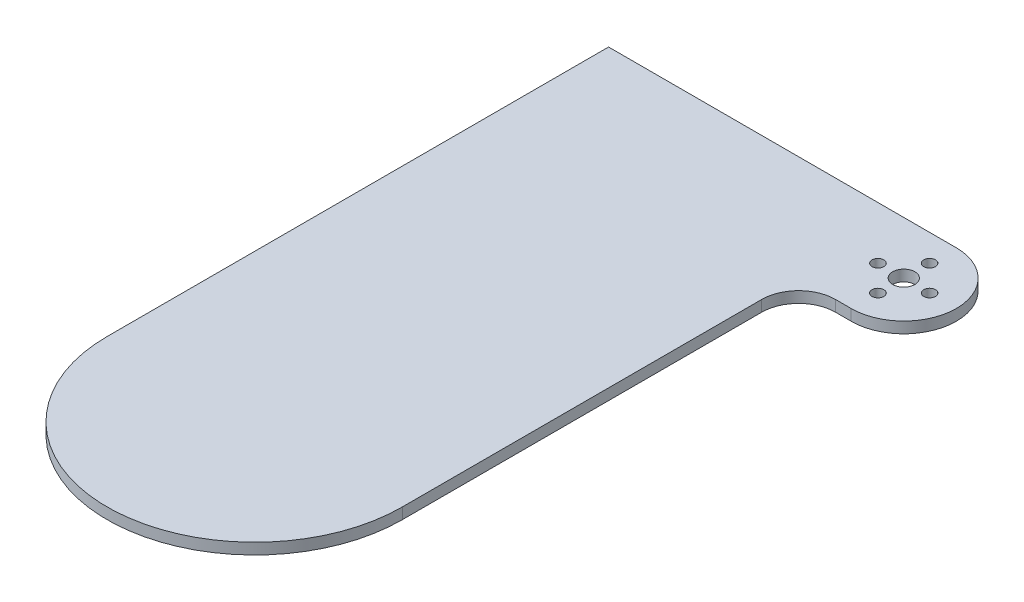
ISO-10303-21;
HEADER;
FILE_DESCRIPTION(('STEP AP214'),'2;1');
FILE_NAME('part.step','',(''),(''),'','','');
FILE_SCHEMA(('AUTOMOTIVE_DESIGN { 1 0 10303 214 1 1 1 1 }'));
ENDSEC;
DATA;
#1=APPLICATION_CONTEXT('core data for automotive mechanical design processes');
#2=APPLICATION_PROTOCOL_DEFINITION('international standard','automotive_design',2000,#1);
#3=PRODUCT_CONTEXT('',#1,'mechanical');
#4=PRODUCT('Part','Part','',(#3));
#5=PRODUCT_RELATED_PRODUCT_CATEGORY('part','',(#4));
#6=PRODUCT_DEFINITION_FORMATION('','',#4);
#7=PRODUCT_DEFINITION_CONTEXT('part definition',#1,'design');
#8=PRODUCT_DEFINITION('design','',#6,#7);
#9=PRODUCT_DEFINITION_SHAPE('','',#8);
#10=(LENGTH_UNIT() NAMED_UNIT(*) SI_UNIT(.MILLI.,.METRE.));
#11=(NAMED_UNIT(*) PLANE_ANGLE_UNIT() SI_UNIT($,.RADIAN.));
#12=(NAMED_UNIT(*) SI_UNIT($,.STERADIAN.) SOLID_ANGLE_UNIT());
#13=UNCERTAINTY_MEASURE_WITH_UNIT(LENGTH_MEASURE(1.E-05),#10,'distance_accuracy_value','');
#14=(GEOMETRIC_REPRESENTATION_CONTEXT(3) GLOBAL_UNCERTAINTY_ASSIGNED_CONTEXT((#13)) GLOBAL_UNIT_ASSIGNED_CONTEXT((#10,
#11,#12)) REPRESENTATION_CONTEXT('',''));
#15=CARTESIAN_POINT('',(0.,0.,0.));
#16=DIRECTION('',(0.,0.,1.));
#17=DIRECTION('',(1.,0.,0.));
#18=AXIS2_PLACEMENT_3D('',#15,#16,#17);
#19=CARTESIAN_POINT('',(34.4749172482589,3.,-48.9718439680969));
#20=DIRECTION('',(0.,-1.,0.));
#21=DIRECTION('',(0.,0.,-1.));
#22=AXIS2_PLACEMENT_3D('',#19,#20,#21);
#23=PLANE('',#22);
#24=CARTESIAN_POINT('',(38.7249172482589,3.,-80.221843968097));
#25=DIRECTION('',(0.,1.,0.));
#26=DIRECTION('',(0.,0.,1.));
#27=AXIS2_PLACEMENT_3D('',#24,#25,#26);
#28=CIRCLE('',#27,1.6);
#29=CARTESIAN_POINT('',(38.7249172482589,3.,-78.621843968097));
#30=VERTEX_POINT('',#29);
#31=EDGE_CURVE('E188',#30,#30,#28,.T.);
#32=ORIENTED_EDGE('',*,*,#31,.F.);
#33=EDGE_LOOP('',(#32));
#34=FACE_BOUND('',#33,.T.);
#35=CARTESIAN_POINT('',(31.724917248259,3.,-73.2218439680969));
#36=DIRECTION('',(0.,1.,0.));
#37=DIRECTION('',(0.,0.,1.));
#38=AXIS2_PLACEMENT_3D('',#35,#36,#37);
#39=CIRCLE('',#38,1.6);
#40=CARTESIAN_POINT('',(31.724917248259,3.,-71.621843968097));
#41=VERTEX_POINT('',#40);
#42=EDGE_CURVE('E182',#41,#41,#39,.T.);
#43=ORIENTED_EDGE('',*,*,#42,.F.);
#44=EDGE_LOOP('',(#43));
#45=FACE_BOUND('',#44,.T.);
#46=CARTESIAN_POINT('',(38.7249172482591,3.,-66.2218439680969));
#47=DIRECTION('',(0.,1.,0.));
#48=DIRECTION('',(0.,0.,1.));
#49=AXIS2_PLACEMENT_3D('',#46,#47,#48);
#50=CIRCLE('',#49,1.6);
#51=CARTESIAN_POINT('',(38.7249172482591,3.,-64.621843968097));
#52=VERTEX_POINT('',#51);
#53=EDGE_CURVE('E176',#52,#52,#50,.T.);
#54=ORIENTED_EDGE('',*,*,#53,.F.);
#55=EDGE_LOOP('',(#54));
#56=FACE_BOUND('',#55,.T.);
#57=CARTESIAN_POINT('',(45.724917248259,3.,-73.2218439680971));
#58=DIRECTION('',(0.,1.,0.));
#59=DIRECTION('',(0.,0.,1.));
#60=AXIS2_PLACEMENT_3D('',#57,#58,#59);
#61=CIRCLE('',#60,1.6);
#62=CARTESIAN_POINT('',(45.724917248259,3.,-71.6218439680971));
#63=VERTEX_POINT('',#62);
#64=EDGE_CURVE('E170',#63,#63,#61,.T.);
#65=ORIENTED_EDGE('',*,*,#64,.F.);
#66=EDGE_LOOP('',(#65));
#67=FACE_BOUND('',#66,.T.);
#68=CARTESIAN_POINT('',(34.4749172482589,3.,-48.9718439680969));
#69=DIRECTION('',(0.,-1.,0.));
#70=DIRECTION('',(0.,0.,-1.));
#71=AXIS2_PLACEMENT_3D('',#68,#69,#70);
#72=CIRCLE('',#71,10.);
#73=CARTESIAN_POINT('',(24.4749172482589,3.,-48.9718439680969));
#74=VERTEX_POINT('',#73);
#75=CARTESIAN_POINT('',(34.474917248259,3.,-58.971843968097));
#76=VERTEX_POINT('',#75);
#77=EDGE_CURVE('E138',#74,#76,#72,.T.);
#78=ORIENTED_EDGE('',*,*,#77,.T.);
#79=DIRECTION('',(1.,0.,0.));
#80=VECTOR('',#79,1.);
#81=CARTESIAN_POINT('',(38.7249172482589,3.,-58.971843968097));
#82=LINE('',#81,#80);
#83=CARTESIAN_POINT('',(38.7249172482589,3.,-58.9718439680969));
#84=VERTEX_POINT('',#83);
#85=EDGE_CURVE('E91',#76,#84,#82,.T.);
#86=ORIENTED_EDGE('',*,*,#85,.T.);
#87=CARTESIAN_POINT('',(38.7249172482589,3.,-73.221843968097));
#88=DIRECTION('',(0.,1.,0.));
#89=DIRECTION('',(0.,0.,1.));
#90=AXIS2_PLACEMENT_3D('',#87,#88,#89);
#91=CIRCLE('',#90,14.25);
#92=CARTESIAN_POINT('',(38.7249172482589,3.,-87.471843968097));
#93=VERTEX_POINT('',#92);
#94=EDGE_CURVE('E150',#84,#93,#91,.T.);
#95=ORIENTED_EDGE('',*,*,#94,.T.);
#96=DIRECTION('',(-1.,0.,0.));
#97=VECTOR('',#96,1.);
#98=CARTESIAN_POINT('',(38.7249172482589,3.,-87.471843968097));
#99=LINE('',#98,#97);
#100=CARTESIAN_POINT('',(-55.5250827517411,3.,-87.471843968097));
#101=VERTEX_POINT('',#100);
#102=EDGE_CURVE('E107',#93,#101,#99,.T.);
#103=ORIENTED_EDGE('',*,*,#102,.T.);
#104=DIRECTION('',(0.,0.,1.));
#105=VECTOR('',#104,1.);
#106=CARTESIAN_POINT('',(-55.5250827517411,3.,48.4281560319028));
#107=LINE('',#106,#105);
#108=CARTESIAN_POINT('',(-55.5250827517411,3.,48.4281560319028));
#109=VERTEX_POINT('',#108);
#110=EDGE_CURVE('E101',#101,#109,#107,.T.);
#111=ORIENTED_EDGE('',*,*,#110,.T.);
#112=CARTESIAN_POINT('',(-15.5250827517411,3.,48.4281560319028));
#113=DIRECTION('',(0.,1.,0.));
#114=DIRECTION('',(0.,0.,1.));
#115=AXIS2_PLACEMENT_3D('',#112,#113,#114);
#116=CIRCLE('',#115,40.);
#117=CARTESIAN_POINT('',(24.4749172482589,3.,48.4281560319028));
#118=VERTEX_POINT('',#117);
#119=EDGE_CURVE('E105',#109,#118,#116,.T.);
#120=ORIENTED_EDGE('',*,*,#119,.T.);
#121=DIRECTION('',(0.,0.,-1.));
#122=VECTOR('',#121,1.);
#123=CARTESIAN_POINT('',(24.4749172482589,3.,48.4281560319028));
#124=LINE('',#123,#122);
#125=EDGE_CURVE('E51',#118,#74,#124,.T.);
#126=ORIENTED_EDGE('',*,*,#125,.T.);
#127=EDGE_LOOP('',(#78,#86,#95,#103,#111,#120,#126));
#128=FACE_BOUND('',#127,.T.);
#129=CARTESIAN_POINT('',(38.7249172482589,3.,-73.221843968097));
#130=DIRECTION('',(0.,1.,0.));
#131=DIRECTION('',(0.,0.,1.));
#132=AXIS2_PLACEMENT_3D('',#129,#130,#131);
#133=CIRCLE('',#132,2.99999999976401);
#134=CARTESIAN_POINT('',(38.7249172482589,3.,-70.221843968333));
#135=VERTEX_POINT('',#134);
#136=EDGE_CURVE('E129',#135,#135,#133,.T.);
#137=ORIENTED_EDGE('',*,*,#136,.F.);
#138=EDGE_LOOP('',(#137));
#139=FACE_BOUND('',#138,.T.);
#140=ADVANCED_FACE('F34',(#34,#45,#56,#67,#128,#139),#23,.F.);
#141=CARTESIAN_POINT('',(34.4749172482589,0.,-48.9718439680969));
#142=DIRECTION('',(0.,-1.,0.));
#143=DIRECTION('',(0.,0.,-1.));
#144=AXIS2_PLACEMENT_3D('',#141,#142,#143);
#145=PLANE('',#144);
#146=CARTESIAN_POINT('',(38.7249172482589,0.,-80.221843968097));
#147=DIRECTION('',(0.,1.,0.));
#148=DIRECTION('',(0.,0.,1.));
#149=AXIS2_PLACEMENT_3D('',#146,#147,#148);
#150=CIRCLE('',#149,1.6);
#151=CARTESIAN_POINT('',(38.7249172482589,0.,-78.621843968097));
#152=VERTEX_POINT('',#151);
#153=EDGE_CURVE('E185',#152,#152,#150,.T.);
#154=ORIENTED_EDGE('',*,*,#153,.T.);
#155=EDGE_LOOP('',(#154));
#156=FACE_BOUND('',#155,.T.);
#157=CARTESIAN_POINT('',(31.724917248259,0.,-73.2218439680969));
#158=DIRECTION('',(0.,1.,0.));
#159=DIRECTION('',(0.,0.,1.));
#160=AXIS2_PLACEMENT_3D('',#157,#158,#159);
#161=CIRCLE('',#160,1.6);
#162=CARTESIAN_POINT('',(31.724917248259,0.,-71.621843968097));
#163=VERTEX_POINT('',#162);
#164=EDGE_CURVE('E179',#163,#163,#161,.T.);
#165=ORIENTED_EDGE('',*,*,#164,.T.);
#166=EDGE_LOOP('',(#165));
#167=FACE_BOUND('',#166,.T.);
#168=CARTESIAN_POINT('',(38.7249172482591,0.,-66.2218439680969));
#169=DIRECTION('',(0.,1.,0.));
#170=DIRECTION('',(0.,0.,1.));
#171=AXIS2_PLACEMENT_3D('',#168,#169,#170);
#172=CIRCLE('',#171,1.6);
#173=CARTESIAN_POINT('',(38.7249172482591,0.,-64.621843968097));
#174=VERTEX_POINT('',#173);
#175=EDGE_CURVE('E173',#174,#174,#172,.T.);
#176=ORIENTED_EDGE('',*,*,#175,.T.);
#177=EDGE_LOOP('',(#176));
#178=FACE_BOUND('',#177,.T.);
#179=CARTESIAN_POINT('',(45.724917248259,0.,-73.2218439680971));
#180=DIRECTION('',(0.,1.,0.));
#181=DIRECTION('',(0.,0.,1.));
#182=AXIS2_PLACEMENT_3D('',#179,#180,#181);
#183=CIRCLE('',#182,1.6);
#184=CARTESIAN_POINT('',(45.724917248259,0.,-71.6218439680971));
#185=VERTEX_POINT('',#184);
#186=EDGE_CURVE('E165',#185,#185,#183,.T.);
#187=ORIENTED_EDGE('',*,*,#186,.T.);
#188=EDGE_LOOP('',(#187));
#189=FACE_BOUND('',#188,.T.);
#190=CARTESIAN_POINT('',(34.4749172482589,0.,-48.9718439680969));
#191=DIRECTION('',(0.,-1.,0.));
#192=DIRECTION('',(0.,0.,-1.));
#193=AXIS2_PLACEMENT_3D('',#190,#191,#192);
#194=CIRCLE('',#193,10.);
#195=CARTESIAN_POINT('',(24.4749172482589,0.,-48.9718439680969));
#196=VERTEX_POINT('',#195);
#197=CARTESIAN_POINT('',(34.474917248259,0.,-58.971843968097));
#198=VERTEX_POINT('',#197);
#199=EDGE_CURVE('E125',#196,#198,#194,.T.);
#200=ORIENTED_EDGE('',*,*,#199,.F.);
#201=DIRECTION('',(0.,0.,-1.));
#202=VECTOR('',#201,1.);
#203=CARTESIAN_POINT('',(24.4749172482589,0.,48.4281560319028));
#204=LINE('',#203,#202);
#205=CARTESIAN_POINT('',(24.4749172482589,0.,48.4281560319028));
#206=VERTEX_POINT('',#205);
#207=EDGE_CURVE('E83',#206,#196,#204,.T.);
#208=ORIENTED_EDGE('',*,*,#207,.F.);
#209=CARTESIAN_POINT('',(-15.5250827517411,0.,48.4281560319028));
#210=DIRECTION('',(0.,1.,0.));
#211=DIRECTION('',(0.,0.,1.));
#212=AXIS2_PLACEMENT_3D('',#209,#210,#211);
#213=CIRCLE('',#212,40.);
#214=CARTESIAN_POINT('',(-55.5250827517411,0.,48.4281560319028));
#215=VERTEX_POINT('',#214);
#216=EDGE_CURVE('E77',#215,#206,#213,.T.);
#217=ORIENTED_EDGE('',*,*,#216,.F.);
#218=DIRECTION('',(0.,0.,1.));
#219=VECTOR('',#218,1.);
#220=CARTESIAN_POINT('',(-55.5250827517411,0.,48.4281560319028));
#221=LINE('',#220,#219);
#222=CARTESIAN_POINT('',(-55.5250827517411,0.,-87.471843968097));
#223=VERTEX_POINT('',#222);
#224=EDGE_CURVE('E115',#223,#215,#221,.T.);
#225=ORIENTED_EDGE('',*,*,#224,.F.);
#226=DIRECTION('',(-1.,0.,0.));
#227=VECTOR('',#226,1.);
#228=CARTESIAN_POINT('',(38.7249172482589,0.,-87.471843968097));
#229=LINE('',#228,#227);
#230=CARTESIAN_POINT('',(38.7249172482589,0.,-87.471843968097));
#231=VERTEX_POINT('',#230);
#232=EDGE_CURVE('E133',#231,#223,#229,.T.);
#233=ORIENTED_EDGE('',*,*,#232,.F.);
#234=CARTESIAN_POINT('',(38.7249172482589,0.,-73.221843968097));
#235=DIRECTION('',(0.,1.,0.));
#236=DIRECTION('',(0.,0.,1.));
#237=AXIS2_PLACEMENT_3D('',#234,#235,#236);
#238=CIRCLE('',#237,14.25);
#239=CARTESIAN_POINT('',(38.7249172482589,0.,-58.9718439680969));
#240=VERTEX_POINT('',#239);
#241=EDGE_CURVE('E131',#240,#231,#238,.T.);
#242=ORIENTED_EDGE('',*,*,#241,.F.);
#243=DIRECTION('',(1.,0.,0.));
#244=VECTOR('',#243,1.);
#245=CARTESIAN_POINT('',(38.7249172482589,0.,-58.971843968097));
#246=LINE('',#245,#244);
#247=EDGE_CURVE('E128',#198,#240,#246,.T.);
#248=ORIENTED_EDGE('',*,*,#247,.F.);
#249=EDGE_LOOP('',(#200,#208,#217,#225,#233,#242,#248));
#250=FACE_BOUND('',#249,.T.);
#251=CARTESIAN_POINT('',(38.7249172482589,0.,-73.221843968097));
#252=DIRECTION('',(0.,1.,0.));
#253=DIRECTION('',(0.,0.,1.));
#254=AXIS2_PLACEMENT_3D('',#251,#252,#253);
#255=CIRCLE('',#254,2.99999999976401);
#256=CARTESIAN_POINT('',(38.7249172482589,0.,-70.221843968333));
#257=VERTEX_POINT('',#256);
#258=EDGE_CURVE('E162',#257,#257,#255,.T.);
#259=ORIENTED_EDGE('',*,*,#258,.T.);
#260=EDGE_LOOP('',(#259));
#261=FACE_BOUND('',#260,.T.);
#262=ADVANCED_FACE('F154',(#156,#167,#178,#189,#250,#261),#145,.T.);
#263=CARTESIAN_POINT('',(34.4749172482589,3.,-48.9718439680969));
#264=DIRECTION('',(0.,-1.,0.));
#265=DIRECTION('',(0.,0.,-1.));
#266=AXIS2_PLACEMENT_3D('',#263,#264,#265);
#267=CYLINDRICAL_SURFACE('',#266,10.);
#268=ORIENTED_EDGE('',*,*,#199,.T.);
#269=DIRECTION('',(0.,-1.,0.));
#270=VECTOR('',#269,1.);
#271=CARTESIAN_POINT('',(34.474917248259,3.,-58.971843968097));
#272=LINE('',#271,#270);
#273=EDGE_CURVE('E11',#76,#198,#272,.T.);
#274=ORIENTED_EDGE('',*,*,#273,.F.);
#275=ORIENTED_EDGE('',*,*,#77,.F.);
#276=DIRECTION('',(0.,-1.,0.));
#277=VECTOR('',#276,1.);
#278=CARTESIAN_POINT('',(24.4749172482589,3.,-48.9718439680969));
#279=LINE('',#278,#277);
#280=EDGE_CURVE('E121',#74,#196,#279,.T.);
#281=ORIENTED_EDGE('',*,*,#280,.T.);
#282=EDGE_LOOP('',(#268,#274,#275,#281));
#283=FACE_BOUND('',#282,.T.);
#284=ADVANCED_FACE('F36',(#283),#267,.F.);
#285=CARTESIAN_POINT('',(38.7249172482589,3.,-58.971843968097));
#286=DIRECTION('',(0.,0.,-1.));
#287=DIRECTION('',(-1.,0.,0.));
#288=AXIS2_PLACEMENT_3D('',#285,#286,#287);
#289=PLANE('',#288);
#290=ORIENTED_EDGE('',*,*,#247,.T.);
#291=DIRECTION('',(0.,-1.,0.));
#292=VECTOR('',#291,1.);
#293=CARTESIAN_POINT('',(38.7249172482589,3.,-58.9718439680969));
#294=LINE('',#293,#292);
#295=EDGE_CURVE('E43',#84,#240,#294,.T.);
#296=ORIENTED_EDGE('',*,*,#295,.F.);
#297=ORIENTED_EDGE('',*,*,#85,.F.);
#298=ORIENTED_EDGE('',*,*,#273,.T.);
#299=EDGE_LOOP('',(#290,#296,#297,#298));
#300=FACE_BOUND('',#299,.T.);
#301=ADVANCED_FACE('F234',(#300),#289,.F.);
#302=CARTESIAN_POINT('',(38.7249172482589,3.,-73.221843968097));
#303=DIRECTION('',(0.,-1.,0.));
#304=DIRECTION('',(0.,0.,-1.));
#305=AXIS2_PLACEMENT_3D('',#302,#303,#304);
#306=CYLINDRICAL_SURFACE('',#305,14.25);
#307=ORIENTED_EDGE('',*,*,#241,.T.);
#308=DIRECTION('',(0.,-1.,0.));
#309=VECTOR('',#308,1.);
#310=CARTESIAN_POINT('',(38.7249172482589,3.,-87.471843968097));
#311=LINE('',#310,#309);
#312=EDGE_CURVE('E142',#93,#231,#311,.T.);
#313=ORIENTED_EDGE('',*,*,#312,.F.);
#314=ORIENTED_EDGE('',*,*,#94,.F.);
#315=ORIENTED_EDGE('',*,*,#295,.T.);
#316=EDGE_LOOP('',(#307,#313,#314,#315));
#317=FACE_BOUND('',#316,.T.);
#318=ADVANCED_FACE('F148',(#317),#306,.T.);
#319=CARTESIAN_POINT('',(38.7249172482589,3.,-87.471843968097));
#320=DIRECTION('',(0.,0.,1.));
#321=DIRECTION('',(1.,0.,0.));
#322=AXIS2_PLACEMENT_3D('',#319,#320,#321);
#323=PLANE('',#322);
#324=ORIENTED_EDGE('',*,*,#232,.T.);
#325=DIRECTION('',(0.,-1.,0.));
#326=VECTOR('',#325,1.);
#327=CARTESIAN_POINT('',(-55.5250827517411,3.,-87.471843968097));
#328=LINE('',#327,#326);
#329=EDGE_CURVE('E116',#101,#223,#328,.T.);
#330=ORIENTED_EDGE('',*,*,#329,.F.);
#331=ORIENTED_EDGE('',*,*,#102,.F.);
#332=ORIENTED_EDGE('',*,*,#312,.T.);
#333=EDGE_LOOP('',(#324,#330,#331,#332));
#334=FACE_BOUND('',#333,.T.);
#335=ADVANCED_FACE('F157',(#334),#323,.F.);
#336=CARTESIAN_POINT('',(-55.5250827517411,3.,48.4281560319028));
#337=DIRECTION('',(1.,0.,0.));
#338=DIRECTION('',(0.,0.,-1.));
#339=AXIS2_PLACEMENT_3D('',#336,#337,#338);
#340=PLANE('',#339);
#341=ORIENTED_EDGE('',*,*,#224,.T.);
#342=DIRECTION('',(0.,-1.,0.));
#343=VECTOR('',#342,1.);
#344=CARTESIAN_POINT('',(-55.5250827517411,3.,48.4281560319028));
#345=LINE('',#344,#343);
#346=EDGE_CURVE('E112',#109,#215,#345,.T.);
#347=ORIENTED_EDGE('',*,*,#346,.F.);
#348=ORIENTED_EDGE('',*,*,#110,.F.);
#349=ORIENTED_EDGE('',*,*,#329,.T.);
#350=EDGE_LOOP('',(#341,#347,#348,#349));
#351=FACE_BOUND('',#350,.T.);
#352=ADVANCED_FACE('F113',(#351),#340,.F.);
#353=CARTESIAN_POINT('',(-15.5250827517411,3.,48.4281560319028));
#354=DIRECTION('',(0.,-1.,0.));
#355=DIRECTION('',(0.,0.,-1.));
#356=AXIS2_PLACEMENT_3D('',#353,#354,#355);
#357=CYLINDRICAL_SURFACE('',#356,40.);
#358=ORIENTED_EDGE('',*,*,#216,.T.);
#359=DIRECTION('',(0.,-1.,0.));
#360=VECTOR('',#359,1.);
#361=CARTESIAN_POINT('',(24.4749172482589,3.,48.4281560319028));
#362=LINE('',#361,#360);
#363=EDGE_CURVE('E117',#118,#206,#362,.T.);
#364=ORIENTED_EDGE('',*,*,#363,.F.);
#365=ORIENTED_EDGE('',*,*,#119,.F.);
#366=ORIENTED_EDGE('',*,*,#346,.T.);
#367=EDGE_LOOP('',(#358,#364,#365,#366));
#368=FACE_BOUND('',#367,.T.);
#369=ADVANCED_FACE('F119',(#368),#357,.T.);
#370=CARTESIAN_POINT('',(24.4749172482589,3.,48.4281560319028));
#371=DIRECTION('',(-1.,0.,0.));
#372=DIRECTION('',(0.,0.,1.));
#373=AXIS2_PLACEMENT_3D('',#370,#371,#372);
#374=PLANE('',#373);
#375=ORIENTED_EDGE('',*,*,#207,.T.);
#376=ORIENTED_EDGE('',*,*,#280,.F.);
#377=ORIENTED_EDGE('',*,*,#125,.F.);
#378=ORIENTED_EDGE('',*,*,#363,.T.);
#379=EDGE_LOOP('',(#375,#376,#377,#378));
#380=FACE_BOUND('',#379,.T.);
#381=ADVANCED_FACE('F216',(#380),#374,.F.);
#382=CARTESIAN_POINT('',(38.7249172482589,3.,-73.221843968097));
#383=DIRECTION('',(0.,-1.,0.));
#384=DIRECTION('',(0.,0.,-1.));
#385=AXIS2_PLACEMENT_3D('',#382,#383,#384);
#386=CYLINDRICAL_SURFACE('',#385,2.99999999976401);
#387=ORIENTED_EDGE('',*,*,#136,.T.);
#388=EDGE_LOOP('',(#387));
#389=FACE_BOUND('',#388,.T.);
#390=ORIENTED_EDGE('',*,*,#258,.F.);
#391=EDGE_LOOP('',(#390));
#392=FACE_BOUND('',#391,.T.);
#393=ADVANCED_FACE('F206',(#389,#392),#386,.F.);
#394=CARTESIAN_POINT('',(45.724917248259,3.,-73.2218439680971));
#395=DIRECTION('',(0.,1.,0.));
#396=DIRECTION('',(0.,0.,1.));
#397=AXIS2_PLACEMENT_3D('',#394,#395,#396);
#398=CYLINDRICAL_SURFACE('',#397,1.6);
#399=ORIENTED_EDGE('',*,*,#186,.F.);
#400=EDGE_LOOP('',(#399));
#401=FACE_BOUND('',#400,.T.);
#402=ORIENTED_EDGE('',*,*,#64,.T.);
#403=EDGE_LOOP('',(#402));
#404=FACE_BOUND('',#403,.T.);
#405=ADVANCED_FACE('F203',(#401,#404),#398,.F.);
#406=CARTESIAN_POINT('',(38.7249172482591,3.,-66.2218439680969));
#407=DIRECTION('',(0.,1.,0.));
#408=DIRECTION('',(0.,0.,1.));
#409=AXIS2_PLACEMENT_3D('',#406,#407,#408);
#410=CYLINDRICAL_SURFACE('',#409,1.6);
#411=ORIENTED_EDGE('',*,*,#175,.F.);
#412=EDGE_LOOP('',(#411));
#413=FACE_BOUND('',#412,.T.);
#414=ORIENTED_EDGE('',*,*,#53,.T.);
#415=EDGE_LOOP('',(#414));
#416=FACE_BOUND('',#415,.T.);
#417=ADVANCED_FACE('F205',(#413,#416),#410,.F.);
#418=CARTESIAN_POINT('',(31.724917248259,3.,-73.2218439680969));
#419=DIRECTION('',(0.,1.,0.));
#420=DIRECTION('',(0.,0.,1.));
#421=AXIS2_PLACEMENT_3D('',#418,#419,#420);
#422=CYLINDRICAL_SURFACE('',#421,1.6);
#423=ORIENTED_EDGE('',*,*,#164,.F.);
#424=EDGE_LOOP('',(#423));
#425=FACE_BOUND('',#424,.T.);
#426=ORIENTED_EDGE('',*,*,#42,.T.);
#427=EDGE_LOOP('',(#426));
#428=FACE_BOUND('',#427,.T.);
#429=ADVANCED_FACE('F213',(#425,#428),#422,.F.);
#430=CARTESIAN_POINT('',(38.7249172482589,3.,-80.221843968097));
#431=DIRECTION('',(0.,1.,0.));
#432=DIRECTION('',(0.,0.,1.));
#433=AXIS2_PLACEMENT_3D('',#430,#431,#432);
#434=CYLINDRICAL_SURFACE('',#433,1.6);
#435=ORIENTED_EDGE('',*,*,#153,.F.);
#436=EDGE_LOOP('',(#435));
#437=FACE_BOUND('',#436,.T.);
#438=ORIENTED_EDGE('',*,*,#31,.T.);
#439=EDGE_LOOP('',(#438));
#440=FACE_BOUND('',#439,.T.);
#441=ADVANCED_FACE('F192',(#437,#440),#434,.F.);
#442=CLOSED_SHELL('',(#140,#262,#284,#301,#318,#335,#352,#369,#381,#393,#405,#417,#429,#441));
#443=MANIFOLD_SOLID_BREP('B2',#442);
#444=ADVANCED_BREP_SHAPE_REPRESENTATION('',(#18,#443),#14);
#445=SHAPE_DEFINITION_REPRESENTATION(#9,#444);
ENDSEC;
END-ISO-10303-21;
